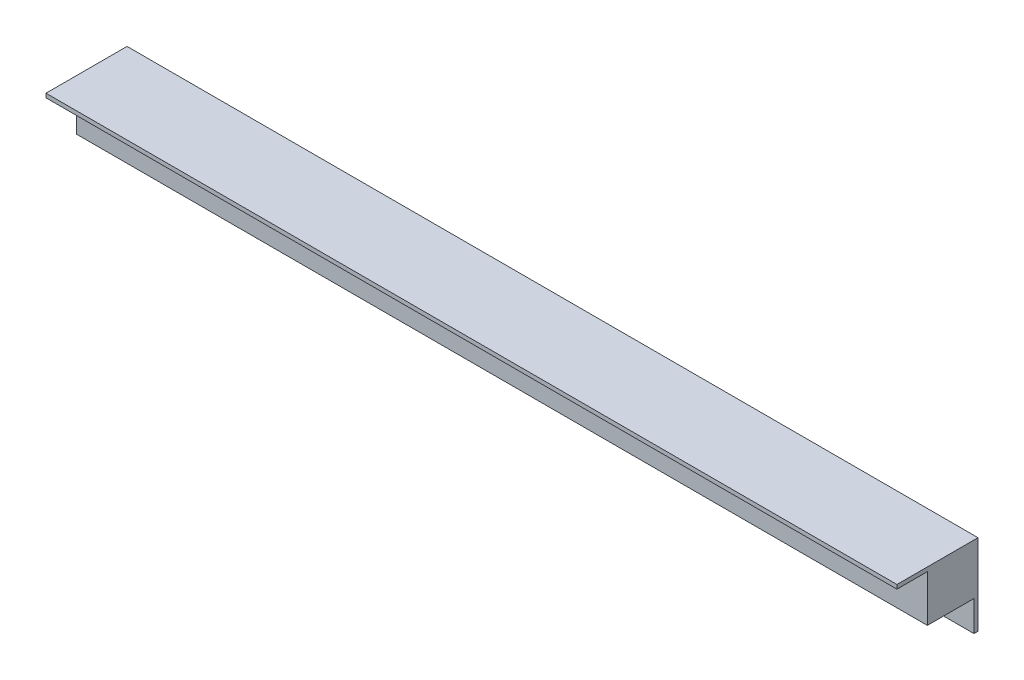
ISO-10303-21;
HEADER;
FILE_DESCRIPTION(('STEP AP214'),'2;1');
FILE_NAME('part.step','',(''),(''),'','','');
FILE_SCHEMA(('AUTOMOTIVE_DESIGN { 1 0 10303 214 1 1 1 1 }'));
ENDSEC;
DATA;
#1=APPLICATION_CONTEXT('core data for automotive mechanical design processes');
#2=APPLICATION_PROTOCOL_DEFINITION('international standard','automotive_design',2000,#1);
#3=PRODUCT_CONTEXT('',#1,'mechanical');
#4=PRODUCT('Part','Part','',(#3));
#5=PRODUCT_RELATED_PRODUCT_CATEGORY('part','',(#4));
#6=PRODUCT_DEFINITION_FORMATION('','',#4);
#7=PRODUCT_DEFINITION_CONTEXT('part definition',#1,'design');
#8=PRODUCT_DEFINITION('design','',#6,#7);
#9=PRODUCT_DEFINITION_SHAPE('','',#8);
#10=(LENGTH_UNIT() NAMED_UNIT(*) SI_UNIT(.MILLI.,.METRE.));
#11=(NAMED_UNIT(*) PLANE_ANGLE_UNIT() SI_UNIT($,.RADIAN.));
#12=(NAMED_UNIT(*) SI_UNIT($,.STERADIAN.) SOLID_ANGLE_UNIT());
#13=UNCERTAINTY_MEASURE_WITH_UNIT(LENGTH_MEASURE(1.E-05),#10,'distance_accuracy_value','');
#14=(GEOMETRIC_REPRESENTATION_CONTEXT(3) GLOBAL_UNCERTAINTY_ASSIGNED_CONTEXT((#13)) GLOBAL_UNIT_ASSIGNED_CONTEXT((#10,
#11,#12)) REPRESENTATION_CONTEXT('',''));
#15=CARTESIAN_POINT('',(0.,0.,0.));
#16=DIRECTION('',(0.,0.,1.));
#17=DIRECTION('',(1.,0.,0.));
#18=AXIS2_PLACEMENT_3D('',#15,#16,#17);
#19=CARTESIAN_POINT('',(-216.593186372745,102.705410821643,40.));
#20=DIRECTION('',(1.,0.,0.));
#21=DIRECTION('',(0.,0.,-1.));
#22=AXIS2_PLACEMENT_3D('',#19,#20,#21);
#23=PLANE('',#22);
#24=DIRECTION('',(0.,-1.,0.));
#25=VECTOR('',#24,1.);
#26=CARTESIAN_POINT('',(-216.593186372745,100.705410821643,2.));
#27=LINE('',#26,#25);
#28=CARTESIAN_POINT('',(-216.593186372745,77.7054108216433,2.));
#29=VERTEX_POINT('',#28);
#30=CARTESIAN_POINT('',(-216.593186372745,62.7054108216433,2.));
#31=VERTEX_POINT('',#30);
#32=EDGE_CURVE('E123',#29,#31,#27,.T.);
#33=ORIENTED_EDGE('',*,*,#32,.F.);
#34=DIRECTION('',(0.,0.,1.));
#35=VECTOR('',#34,1.);
#36=CARTESIAN_POINT('',(-216.593186372745,77.7054108216433,2.));
#37=LINE('',#36,#35);
#38=CARTESIAN_POINT('',(-216.593186372745,77.7054108216433,25.));
#39=VERTEX_POINT('',#38);
#40=EDGE_CURVE('E147',#29,#39,#37,.T.);
#41=ORIENTED_EDGE('',*,*,#40,.T.);
#42=DIRECTION('',(0.,1.,0.));
#43=VECTOR('',#42,1.);
#44=CARTESIAN_POINT('',(-216.593186372745,100.705410821643,25.));
#45=LINE('',#44,#43);
#46=CARTESIAN_POINT('',(-216.593186372745,100.705410821643,25.));
#47=VERTEX_POINT('',#46);
#48=EDGE_CURVE('E122',#39,#47,#45,.T.);
#49=ORIENTED_EDGE('',*,*,#48,.T.);
#50=DIRECTION('',(0.,0.,-1.));
#51=VECTOR('',#50,1.);
#52=CARTESIAN_POINT('',(-216.593186372745,100.705410821643,2.));
#53=LINE('',#52,#51);
#54=CARTESIAN_POINT('',(-216.593186372745,100.705410821643,40.));
#55=VERTEX_POINT('',#54);
#56=EDGE_CURVE('E115',#55,#47,#53,.T.);
#57=ORIENTED_EDGE('',*,*,#56,.F.);
#58=DIRECTION('',(0.,-1.,0.));
#59=VECTOR('',#58,1.);
#60=CARTESIAN_POINT('',(-216.593186372745,102.705410821643,40.));
#61=LINE('',#60,#59);
#62=CARTESIAN_POINT('',(-216.593186372745,102.705410821643,40.));
#63=VERTEX_POINT('',#62);
#64=EDGE_CURVE('E85',#63,#55,#61,.T.);
#65=ORIENTED_EDGE('',*,*,#64,.F.);
#66=DIRECTION('',(0.,0.,-1.));
#67=VECTOR('',#66,1.);
#68=CARTESIAN_POINT('',(-216.593186372745,102.705410821643,40.));
#69=LINE('',#68,#67);
#70=CARTESIAN_POINT('',(-216.593186372745,102.705410821643,0.));
#71=VERTEX_POINT('',#70);
#72=EDGE_CURVE('E78',#63,#71,#69,.T.);
#73=ORIENTED_EDGE('',*,*,#72,.T.);
#74=DIRECTION('',(0.,-1.,0.));
#75=VECTOR('',#74,1.);
#76=CARTESIAN_POINT('',(-216.593186372745,102.705410821643,0.));
#77=LINE('',#76,#75);
#78=CARTESIAN_POINT('',(-216.593186372745,62.7054108216433,0.));
#79=VERTEX_POINT('',#78);
#80=EDGE_CURVE('E92',#71,#79,#77,.T.);
#81=ORIENTED_EDGE('',*,*,#80,.T.);
#82=DIRECTION('',(0.,0.,-1.));
#83=VECTOR('',#82,1.);
#84=CARTESIAN_POINT('',(-216.593186372745,62.7054108216433,40.));
#85=LINE('',#84,#83);
#86=EDGE_CURVE('E110',#31,#79,#85,.T.);
#87=ORIENTED_EDGE('',*,*,#86,.F.);
#88=EDGE_LOOP('',(#33,#41,#49,#57,#65,#73,#81,#87));
#89=FACE_BOUND('',#88,.T.);
#90=ADVANCED_FACE('F33',(#89),#23,.F.);
#91=CARTESIAN_POINT('',(-216.593186372745,62.7054108216433,40.));
#92=DIRECTION('',(0.,1.,0.));
#93=DIRECTION('',(0.,0.,1.));
#94=AXIS2_PLACEMENT_3D('',#91,#92,#93);
#95=PLANE('',#94);
#96=DIRECTION('',(0.,0.,-1.));
#97=VECTOR('',#96,1.);
#98=CARTESIAN_POINT('',(203.406813627255,62.7054108216433,40.));
#99=LINE('',#98,#97);
#100=CARTESIAN_POINT('',(203.406813627255,62.7054108216433,2.));
#101=VERTEX_POINT('',#100);
#102=CARTESIAN_POINT('',(203.406813627255,62.7054108216433,0.));
#103=VERTEX_POINT('',#102);
#104=EDGE_CURVE('E108',#101,#103,#99,.T.);
#105=ORIENTED_EDGE('',*,*,#104,.F.);
#106=DIRECTION('',(-1.,0.,0.));
#107=VECTOR('',#106,1.);
#108=CARTESIAN_POINT('',(783.406813627255,62.7054108216433,2.));
#109=LINE('',#108,#107);
#110=EDGE_CURVE('E101',#101,#31,#109,.T.);
#111=ORIENTED_EDGE('',*,*,#110,.T.);
#112=ORIENTED_EDGE('',*,*,#86,.T.);
#113=DIRECTION('',(1.,0.,0.));
#114=VECTOR('',#113,1.);
#115=CARTESIAN_POINT('',(-216.593186372745,62.7054108216433,0.));
#116=LINE('',#115,#114);
#117=EDGE_CURVE('E98',#79,#103,#116,.T.);
#118=ORIENTED_EDGE('',*,*,#117,.T.);
#119=EDGE_LOOP('',(#105,#111,#112,#118));
#120=FACE_BOUND('',#119,.T.);
#121=ADVANCED_FACE('F179',(#120),#95,.F.);
#122=CARTESIAN_POINT('',(203.406813627255,102.705410821643,40.));
#123=DIRECTION('',(-1.,0.,0.));
#124=DIRECTION('',(0.,0.,1.));
#125=AXIS2_PLACEMENT_3D('',#122,#123,#124);
#126=PLANE('',#125);
#127=DIRECTION('',(0.,0.,-1.));
#128=VECTOR('',#127,1.);
#129=CARTESIAN_POINT('',(203.406813627255,77.7054108216433,2.));
#130=LINE('',#129,#128);
#131=CARTESIAN_POINT('',(203.406813627255,77.7054108216433,25.));
#132=VERTEX_POINT('',#131);
#133=CARTESIAN_POINT('',(203.406813627255,77.7054108216433,2.));
#134=VERTEX_POINT('',#133);
#135=EDGE_CURVE('E133',#132,#134,#130,.T.);
#136=ORIENTED_EDGE('',*,*,#135,.T.);
#137=DIRECTION('',(0.,-1.,0.));
#138=VECTOR('',#137,1.);
#139=CARTESIAN_POINT('',(203.406813627255,102.705410821643,2.));
#140=LINE('',#139,#138);
#141=EDGE_CURVE('E11',#134,#101,#140,.T.);
#142=ORIENTED_EDGE('',*,*,#141,.T.);
#143=ORIENTED_EDGE('',*,*,#104,.T.);
#144=DIRECTION('',(0.,1.,0.));
#145=VECTOR('',#144,1.);
#146=CARTESIAN_POINT('',(203.406813627255,102.705410821643,0.));
#147=LINE('',#146,#145);
#148=CARTESIAN_POINT('',(203.406813627255,102.705410821643,0.));
#149=VERTEX_POINT('',#148);
#150=EDGE_CURVE('E86',#103,#149,#147,.T.);
#151=ORIENTED_EDGE('',*,*,#150,.T.);
#152=DIRECTION('',(0.,0.,-1.));
#153=VECTOR('',#152,1.);
#154=CARTESIAN_POINT('',(203.406813627255,102.705410821643,40.));
#155=LINE('',#154,#153);
#156=CARTESIAN_POINT('',(203.406813627255,102.705410821643,40.));
#157=VERTEX_POINT('',#156);
#158=EDGE_CURVE('E81',#157,#149,#155,.T.);
#159=ORIENTED_EDGE('',*,*,#158,.F.);
#160=DIRECTION('',(0.,1.,0.));
#161=VECTOR('',#160,1.);
#162=CARTESIAN_POINT('',(203.406813627255,102.705410821643,40.));
#163=LINE('',#162,#161);
#164=CARTESIAN_POINT('',(203.406813627255,100.705410821643,40.));
#165=VERTEX_POINT('',#164);
#166=EDGE_CURVE('E126',#165,#157,#163,.T.);
#167=ORIENTED_EDGE('',*,*,#166,.F.);
#168=DIRECTION('',(0.,0.,-1.));
#169=VECTOR('',#168,1.);
#170=CARTESIAN_POINT('',(203.406813627255,100.705410821643,40.));
#171=LINE('',#170,#169);
#172=CARTESIAN_POINT('',(203.406813627255,100.705410821643,25.));
#173=VERTEX_POINT('',#172);
#174=EDGE_CURVE('E47',#165,#173,#171,.T.);
#175=ORIENTED_EDGE('',*,*,#174,.T.);
#176=DIRECTION('',(0.,-1.,0.));
#177=VECTOR('',#176,1.);
#178=CARTESIAN_POINT('',(203.406813627255,100.705410821643,25.));
#179=LINE('',#178,#177);
#180=EDGE_CURVE('E136',#173,#132,#179,.T.);
#181=ORIENTED_EDGE('',*,*,#180,.T.);
#182=EDGE_LOOP('',(#136,#142,#143,#151,#159,#167,#175,#181));
#183=FACE_BOUND('',#182,.T.);
#184=ADVANCED_FACE('F154',(#183),#126,.F.);
#185=CARTESIAN_POINT('',(-216.593186372745,102.705410821643,40.));
#186=DIRECTION('',(0.,-1.,0.));
#187=DIRECTION('',(0.,0.,-1.));
#188=AXIS2_PLACEMENT_3D('',#185,#186,#187);
#189=PLANE('',#188);
#190=DIRECTION('',(-1.,0.,0.));
#191=VECTOR('',#190,1.);
#192=CARTESIAN_POINT('',(-216.593186372745,102.705410821643,0.));
#193=LINE('',#192,#191);
#194=EDGE_CURVE('E75',#149,#71,#193,.T.);
#195=ORIENTED_EDGE('',*,*,#194,.T.);
#196=ORIENTED_EDGE('',*,*,#72,.F.);
#197=DIRECTION('',(-1.,0.,0.));
#198=VECTOR('',#197,1.);
#199=CARTESIAN_POINT('',(-216.593186372745,102.705410821643,40.));
#200=LINE('',#199,#198);
#201=EDGE_CURVE('E56',#157,#63,#200,.T.);
#202=ORIENTED_EDGE('',*,*,#201,.F.);
#203=ORIENTED_EDGE('',*,*,#158,.T.);
#204=EDGE_LOOP('',(#195,#196,#202,#203));
#205=FACE_BOUND('',#204,.T.);
#206=ADVANCED_FACE('F77',(#205),#189,.F.);
#207=CARTESIAN_POINT('',(0.,0.,40.));
#208=DIRECTION('',(0.,0.,1.));
#209=DIRECTION('',(1.,0.,0.));
#210=AXIS2_PLACEMENT_3D('',#207,#208,#209);
#211=PLANE('',#210);
#212=DIRECTION('',(-1.,0.,0.));
#213=VECTOR('',#212,1.);
#214=CARTESIAN_POINT('',(0.,100.705410821643,40.));
#215=LINE('',#214,#213);
#216=EDGE_CURVE('E40',#165,#55,#215,.T.);
#217=ORIENTED_EDGE('',*,*,#216,.F.);
#218=ORIENTED_EDGE('',*,*,#166,.T.);
#219=ORIENTED_EDGE('',*,*,#201,.T.);
#220=ORIENTED_EDGE('',*,*,#64,.T.);
#221=EDGE_LOOP('',(#217,#218,#219,#220));
#222=FACE_BOUND('',#221,.T.);
#223=ADVANCED_FACE('F125',(#222),#211,.T.);
#224=CARTESIAN_POINT('',(0.,0.,0.));
#225=DIRECTION('',(0.,0.,1.));
#226=DIRECTION('',(1.,0.,0.));
#227=AXIS2_PLACEMENT_3D('',#224,#225,#226);
#228=PLANE('',#227);
#229=ORIENTED_EDGE('',*,*,#80,.F.);
#230=ORIENTED_EDGE('',*,*,#194,.F.);
#231=ORIENTED_EDGE('',*,*,#150,.F.);
#232=ORIENTED_EDGE('',*,*,#117,.F.);
#233=EDGE_LOOP('',(#229,#230,#231,#232));
#234=FACE_BOUND('',#233,.T.);
#235=ADVANCED_FACE('F96',(#234),#228,.F.);
#236=CARTESIAN_POINT('',(783.406813627255,100.705410821643,2.));
#237=DIRECTION('',(0.,0.,-1.));
#238=DIRECTION('',(0.,1.,0.));
#239=AXIS2_PLACEMENT_3D('',#236,#237,#238);
#240=PLANE('',#239);
#241=ORIENTED_EDGE('',*,*,#141,.F.);
#242=DIRECTION('',(-1.,0.,0.));
#243=VECTOR('',#242,1.);
#244=CARTESIAN_POINT('',(235.933725561836,77.7054108216433,2.));
#245=LINE('',#244,#243);
#246=EDGE_CURVE('E137',#134,#29,#245,.T.);
#247=ORIENTED_EDGE('',*,*,#246,.T.);
#248=ORIENTED_EDGE('',*,*,#32,.T.);
#249=ORIENTED_EDGE('',*,*,#110,.F.);
#250=EDGE_LOOP('',(#241,#247,#248,#249));
#251=FACE_BOUND('',#250,.T.);
#252=ADVANCED_FACE('F171',(#251),#240,.F.);
#253=CARTESIAN_POINT('',(783.406813627255,100.705410821643,2.));
#254=DIRECTION('',(0.,1.,0.));
#255=DIRECTION('',(0.,0.,1.));
#256=AXIS2_PLACEMENT_3D('',#253,#254,#255);
#257=PLANE('',#256);
#258=ORIENTED_EDGE('',*,*,#56,.T.);
#259=DIRECTION('',(-1.,0.,0.));
#260=VECTOR('',#259,1.);
#261=CARTESIAN_POINT('',(235.933725561836,100.705410821643,25.));
#262=LINE('',#261,#260);
#263=EDGE_CURVE('E143',#173,#47,#262,.T.);
#264=ORIENTED_EDGE('',*,*,#263,.F.);
#265=ORIENTED_EDGE('',*,*,#174,.F.);
#266=ORIENTED_EDGE('',*,*,#216,.T.);
#267=EDGE_LOOP('',(#258,#264,#265,#266));
#268=FACE_BOUND('',#267,.T.);
#269=ADVANCED_FACE('F113',(#268),#257,.F.);
#270=CARTESIAN_POINT('',(235.933725561836,100.705410821643,25.));
#271=DIRECTION('',(0.,0.,1.));
#272=DIRECTION('',(0.,-1.,0.));
#273=AXIS2_PLACEMENT_3D('',#270,#271,#272);
#274=PLANE('',#273);
#275=ORIENTED_EDGE('',*,*,#180,.F.);
#276=ORIENTED_EDGE('',*,*,#263,.T.);
#277=ORIENTED_EDGE('',*,*,#48,.F.);
#278=DIRECTION('',(-1.,0.,0.));
#279=VECTOR('',#278,1.);
#280=CARTESIAN_POINT('',(235.933725561836,77.7054108216433,25.));
#281=LINE('',#280,#279);
#282=EDGE_CURVE('E140',#132,#39,#281,.T.);
#283=ORIENTED_EDGE('',*,*,#282,.F.);
#284=EDGE_LOOP('',(#275,#276,#277,#283));
#285=FACE_BOUND('',#284,.T.);
#286=ADVANCED_FACE('F161',(#285),#274,.T.);
#287=CARTESIAN_POINT('',(235.933725561836,77.7054108216433,2.));
#288=DIRECTION('',(0.,-1.,0.));
#289=DIRECTION('',(0.,0.,-1.));
#290=AXIS2_PLACEMENT_3D('',#287,#288,#289);
#291=PLANE('',#290);
#292=ORIENTED_EDGE('',*,*,#135,.F.);
#293=ORIENTED_EDGE('',*,*,#282,.T.);
#294=ORIENTED_EDGE('',*,*,#40,.F.);
#295=ORIENTED_EDGE('',*,*,#246,.F.);
#296=EDGE_LOOP('',(#292,#293,#294,#295));
#297=FACE_BOUND('',#296,.T.);
#298=ADVANCED_FACE('F165',(#297),#291,.T.);
#299=CLOSED_SHELL('',(#90,#121,#184,#206,#223,#235,#252,#269,#286,#298));
#300=MANIFOLD_SOLID_BREP('B2',#299);
#301=ADVANCED_BREP_SHAPE_REPRESENTATION('',(#18,#300),#14);
#302=SHAPE_DEFINITION_REPRESENTATION(#9,#301);
ENDSEC;
END-ISO-10303-21;
